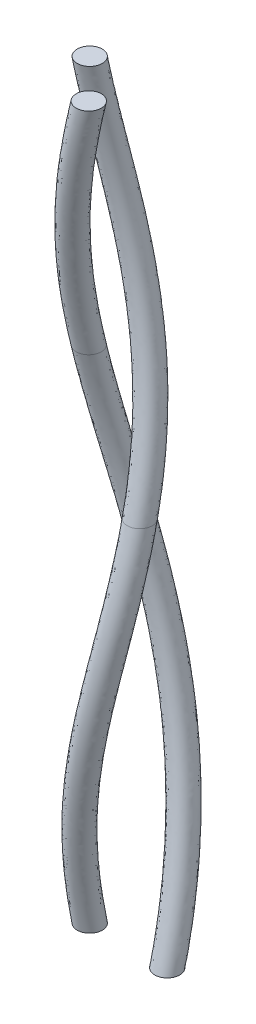
ISO-10303-21;
HEADER;
FILE_DESCRIPTION(('STEP AP214'),'2;1');
FILE_NAME('part.step','',(''),(''),'','','');
FILE_SCHEMA(('AUTOMOTIVE_DESIGN { 1 0 10303 214 1 1 1 1 }'));
ENDSEC;
DATA;
#1=APPLICATION_CONTEXT('core data for automotive mechanical design processes');
#2=APPLICATION_PROTOCOL_DEFINITION('international standard','automotive_design',2000,#1);
#3=PRODUCT_CONTEXT('',#1,'mechanical');
#4=PRODUCT('Part','Part','',(#3));
#5=PRODUCT_RELATED_PRODUCT_CATEGORY('part','',(#4));
#6=PRODUCT_DEFINITION_FORMATION('','',#4);
#7=PRODUCT_DEFINITION_CONTEXT('part definition',#1,'design');
#8=PRODUCT_DEFINITION('design','',#6,#7);
#9=PRODUCT_DEFINITION_SHAPE('','',#8);
#10=(LENGTH_UNIT() NAMED_UNIT(*) SI_UNIT(.MILLI.,.METRE.));
#11=(NAMED_UNIT(*) PLANE_ANGLE_UNIT() SI_UNIT($,.RADIAN.));
#12=(NAMED_UNIT(*) SI_UNIT($,.STERADIAN.) SOLID_ANGLE_UNIT());
#13=UNCERTAINTY_MEASURE_WITH_UNIT(LENGTH_MEASURE(1.E-05),#10,'distance_accuracy_value','');
#14=(GEOMETRIC_REPRESENTATION_CONTEXT(3) GLOBAL_UNCERTAINTY_ASSIGNED_CONTEXT((#13)) GLOBAL_UNIT_ASSIGNED_CONTEXT((#10,
#11,#12)) REPRESENTATION_CONTEXT('',''));
#15=CARTESIAN_POINT('',(0.,0.,0.));
#16=DIRECTION('',(0.,0.,1.));
#17=DIRECTION('',(1.,0.,0.));
#18=AXIS2_PLACEMENT_3D('',#15,#16,#17);
#19=CARTESIAN_POINT('',(0.,0.,0.));
#20=DIRECTION('',(0.,1.,0.));
#21=DIRECTION('',(0.,0.,1.));
#22=AXIS2_PLACEMENT_3D('',#19,#20,#21);
#23=PLANE('',#22);
#24=CARTESIAN_POINT('',(-1.02935078025205,0.,0.));
#25=CARTESIAN_POINT('',(-1.02934778491233,0.,0.0281075656694176));
#26=CARTESIAN_POINT('',(-1.03172392125893,0.,0.0561967953211833));
#27=CARTESIAN_POINT('',(-1.04115976984137,0.,0.111621935563756));
#28=CARTESIAN_POINT('',(-1.04822511897658,0.,0.13895689820842));
#29=CARTESIAN_POINT('',(-1.06684191221286,0.,0.192032338497883));
#30=CARTESIAN_POINT('',(-1.07839058986254,0.,0.21777378808967));
#31=CARTESIAN_POINT('',(-1.10564589954854,0.,0.2669539843828));
#32=CARTESIAN_POINT('',(-1.12135265355608,0.,0.290392663508009));
#33=CARTESIAN_POINT('',(-1.15647770707939,0.,0.334299396001291));
#34=CARTESIAN_POINT('',(-1.17589587927898,0.,0.354767551227601));
#35=CARTESIAN_POINT('',(-1.2178937205352,0.,0.39215418800142));
#36=CARTESIAN_POINT('',(-1.24047351368511,0.,0.409072530153988));
#37=CARTESIAN_POINT('',(-1.28813652173462,0.,0.438867901355163));
#38=CARTESIAN_POINT('',(-1.31321800809676,0.,0.451747695677338));
#39=CARTESIAN_POINT('',(-1.36522122099889,0.,0.473130977814567));
#40=CARTESIAN_POINT('',(-1.39214535795949,0.,0.481628604283394));
#41=CARTESIAN_POINT('',(-1.44701952120674,0.,0.493975642278158));
#42=CARTESIAN_POINT('',(-1.47496882823875,0.,0.497828250800084));
#43=CARTESIAN_POINT('',(-1.53111884926834,0.,0.500786679649745));
#44=CARTESIAN_POINT('',(-1.55931957452949,0.,0.499892286233489));
#45=CARTESIAN_POINT('',(-1.61516916871067,0.,0.493381758688196));
#46=CARTESIAN_POINT('',(-1.64281806497723,0.,0.487765859136626));
#47=CARTESIAN_POINT('',(-1.69678214168477,0.,0.471971579221971));
#48=CARTESIAN_POINT('',(-1.7230972495742,0.,0.461792950964673));
#49=CARTESIAN_POINT('',(-1.77362742512537,0.,0.437170758976721));
#50=CARTESIAN_POINT('',(-1.79784393615686,0.,0.422730157144034));
#51=CARTESIAN_POINT('',(-1.84354152491675,0.,0.389968725204407));
#52=CARTESIAN_POINT('',(-1.86501891259351,0.,0.371642747467175));
#53=CARTESIAN_POINT('',(-1.90456256322821,0.,0.331670658783917));
#54=CARTESIAN_POINT('',(-1.92263344629098,0.,0.310029117922739));
#55=CARTESIAN_POINT('',(-1.95491104416531,0.,0.263988527759386));
#56=CARTESIAN_POINT('',(-1.96911230278507,0.,0.239585652828287));
#57=CARTESIAN_POINT('',(-1.99319466726297,0.,0.188780155368334));
#58=CARTESIAN_POINT('',(-2.00308236452988,0.,0.162380656766238));
#59=CARTESIAN_POINT('',(-2.01830195804453,0.,0.108251753989095));
#60=CARTESIAN_POINT('',(-2.02362622468371,0.,0.0805202041628728));
#61=CARTESIAN_POINT('',(-2.02953942841934,0.,0.0245567605973392));
#62=CARTESIAN_POINT('',(-2.03012836551579,0.,-0.0036751331419727));
#63=CARTESIAN_POINT('',(-2.0265572846441,0.,-0.0597894942630455));
#64=CARTESIAN_POINT('',(-2.02240517622573,0.,-0.0876724653989984));
#65=CARTESIAN_POINT('',(-2.009472474825,0.,-0.14238904502068));
#66=CARTESIAN_POINT('',(-2.00068478311646,0.,-0.169220976105307));
#67=CARTESIAN_POINT('',(-1.97874199769132,0.,-0.220990594946259));
#68=CARTESIAN_POINT('',(-1.9655930392013,0.,-0.245930883560229));
#69=CARTESIAN_POINT('',(-1.93527639305996,0.,-0.293284543883329));
#70=CARTESIAN_POINT('',(-1.91810323222205,0.,-0.315694411983951));
#71=CARTESIAN_POINT('',(-1.88026158226737,0.,-0.357282758548085));
#72=CARTESIAN_POINT('',(-1.8595977775233,0.,-0.376465499784306));
#73=CARTESIAN_POINT('',(-1.81532923146071,0.,-0.411104304744368));
#74=CARTESIAN_POINT('',(-1.79172245963676,0.,-0.426557773626497));
#75=CARTESIAN_POINT('',(-1.74225089089742,0.,-0.45328126028907));
#76=CARTESIAN_POINT('',(-1.716386216739,0.,-0.464551505327056));
#77=CARTESIAN_POINT('',(-1.66313055076695,0.,-0.482590301878281));
#78=CARTESIAN_POINT('',(-1.6357394831862,0.,-0.489358629709243));
#79=CARTESIAN_POINT('',(-1.58021110221265,0.,-0.498200352920289));
#80=CARTESIAN_POINT('',(-1.55207382247547,0.,-0.500273959678384));
#81=CARTESIAN_POINT('',(-1.49583099489753,0.,-0.499667753972408));
#82=CARTESIAN_POINT('',(-1.46772548228668,0.,-0.496984664792098));
#83=CARTESIAN_POINT('',(-1.41240171824657,0.,-0.486941754879314));
#84=CARTESIAN_POINT('',(-1.38518233459034,0.,-0.479588169815938));
#85=CARTESIAN_POINT('',(-1.3323448865272,0.,-0.460411867683127));
#86=CARTESIAN_POINT('',(-1.3067279345716,0.,-0.448586085155848));
#87=CARTESIAN_POINT('',(-1.25784405051188,0.,-0.420802184086019));
#88=CARTESIAN_POINT('',(-1.23457702618697,0.,-0.404844227794565));
#89=CARTESIAN_POINT('',(-1.19105152434066,0.,-0.369247862358682));
#90=CARTESIAN_POINT('',(-1.17079315003659,0.,-0.349609326997414));
#91=CARTESIAN_POINT('',(-1.13386150566105,0.,-0.307211246177597));
#92=CARTESIAN_POINT('',(-1.11718813043453,0.,-0.284451792293772));
#93=CARTESIAN_POINT('',(-1.08789017474263,0.,-0.236439115378521));
#94=CARTESIAN_POINT('',(-1.07526809651121,0.,-0.211184363700803));
#95=CARTESIAN_POINT('',(-1.05445728370464,0.,-0.158955143146708));
#96=CARTESIAN_POINT('',(-1.0462632348178,0.,-0.131982779342234));
#97=CARTESIAN_POINT('',(-1.03306417630564,0.,-0.070188947042272));
#98=CARTESIAN_POINT('',(-1.02935451864391,0.,-0.0350801927224873));
#99=CARTESIAN_POINT('',(-1.02935078025205,0.,0.));
#100=B_SPLINE_CURVE_WITH_KNOTS('',3,(#24,#25,#26,#27,#28,#29,#30,#31,#32,#33,#34,#35,#36,#37,
#38,#39,#40,#41,#42,#43,#44,#45,#46,#47,#48,#49,#50,#51,#52,#53,#54,#55,#56,#57,#58,#59,#60,#61,
#62,#63,#64,#65,#66,#67,#68,#69,#70,#71,#72,#73,#74,#75,#76,#77,#78,#79,#80,#81,#82,#83,#84,#85,
#86,#87,#88,#89,#90,#91,#92,#93,#94,#95,#96,#97,#98,#99),.UNSPECIFIED.,.T.,.F.,(4,2,2,2,2,2,2,2,
2,2,2,2,2,2,2,2,2,2,2,2,2,2,2,2,2,2,2,2,2,2,2,2,2,2,2,2,2,4),(0.,0.0841916038121417,
0.168484598045371,0.252725661494656,0.336969196308829,0.421209841758488,0.505453794571877,
0.589639937279774,0.67393839256728,0.758178795129522,0.842422990829589,0.926663001292596,
1.01090758909161,1.09509376764329,1.17939218708701,1.26357544019679,1.34787678505409,
1.43204885674619,1.5163613828988,1.60067390905153,1.68484598074376,1.76914732560136,
1.85333057871152,1.93762899815566,2.02181517670778,2.10605976450711,2.19029977497041,
2.27454397067062,2.3587843732329,2.44308282852008,2.52726897122762,2.6115129240407,
2.69575356949004,2.77999710430378,2.86423816775269,2.94853116198561,3.03272276579744,
3.13779973055785),.UNSPECIFIED.);
#101=CARTESIAN_POINT('',(-1.02935078025205,0.,0.));
#102=VERTEX_POINT('',#101);
#103=EDGE_CURVE('P0_E20',#102,#102,#100,.T.);
#104=ORIENTED_EDGE('',*,*,#103,.T.);
#105=EDGE_LOOP('',(#104));
#106=FACE_BOUND('',#105,.T.);
#107=ADVANCED_FACE('P0_F16',(#106),#23,.F.);
#108=CARTESIAN_POINT('',(-2.02935078025,0.,0.));
#109=CARTESIAN_POINT('',(-2.02935078025,0.,2.));
#110=CARTESIAN_POINT('',(-0.0293507802541,0.,1.));
#111=CARTESIAN_POINT('',(-0.0293507802541,0.,-1.));
#112=CARTESIAN_POINT('',(-2.02935078025,0.,-2.));
#113=CARTESIAN_POINT('',(-2.02935078025,0.,0.));
#114=CARTESIAN_POINT('',(-2.02935078022,1.68646457974,0.337952972793));
#115=CARTESIAN_POINT('',(-2.02935078022,1.68646457974,2.33795297284));
#116=CARTESIAN_POINT('',(-0.0293507802355,1.54490316746,1.33795297281));
#117=CARTESIAN_POINT('',(-0.0293507802355,1.54490316746,-0.662047027229));
#118=CARTESIAN_POINT('',(-2.02935078022,1.68646457974,-1.66204702719));
#119=CARTESIAN_POINT('',(-2.02935078022,1.68646457974,0.337952972793));
#120=CARTESIAN_POINT('',(-1.88013932247,3.37292915642,0.675905945559));
#121=CARTESIAN_POINT('',(-1.88013932247,3.37292915642,2.67590592559));
#122=CARTESIAN_POINT('',(0.107335925808,3.08980633789,1.67590593993));
#123=CARTESIAN_POINT('',(0.107335925808,3.08980633791,-0.324094051256));
#124=CARTESIAN_POINT('',(-1.88013928179,3.37292915641,-1.32409406007));
#125=CARTESIAN_POINT('',(-1.88013932247,3.37292915642,0.675905945559));
#126=CARTESIAN_POINT('',(-1.58113487652,5.03733098523,0.934566611814001));
#127=CARTESIAN_POINT('',(-1.58113487652,5.03733098523,2.93456661015));
#128=CARTESIAN_POINT('',(0.381555449184,4.65319651354,1.93456661215));
#129=CARTESIAN_POINT('',(0.381555449184,4.65319651354,-0.0654333881865));
#130=CARTESIAN_POINT('',(-1.58113487652,5.03733098523,-1.06543338785));
#131=CARTESIAN_POINT('',(-1.58113487652,5.03733098523,0.934566611814001));
#132=CARTESIAN_POINT('',(-0.912997707135001,8.0854853718,1.12109178218));
#133=CARTESIAN_POINT('',(-0.912997707135001,8.0854853718,3.12109178357));
#134=CARTESIAN_POINT('',(1.03479747651,7.62778621052,2.12109178191));
#135=CARTESIAN_POINT('',(1.03479747651,7.62778621052,0.121091782185));
#136=CARTESIAN_POINT('',(-0.912997707135001,8.0854853718,-0.878908218093));
#137=CARTESIAN_POINT('',(-0.912997707135001,8.0854853718,1.12109178218));
#138=CARTESIAN_POINT('',(-0.330100700506,11.0337392183,0.814995660077001));
#139=CARTESIAN_POINT('',(-0.330100700506,11.0337392183,2.81499565892));
#140=CARTESIAN_POINT('',(1.64240748828,10.6965793179,1.81499566031));
#141=CARTESIAN_POINT('',(1.64240748828,10.6965793179,-0.185004339923));
#142=CARTESIAN_POINT('',(-0.330100700506,11.0337392183,-1.18500433969));
#143=CARTESIAN_POINT('',(-0.330100700506,11.0337392183,0.814995660077001));
#144=CARTESIAN_POINT('',(-0.129766807212,12.3552487741,0.580108745187));
#145=CARTESIAN_POINT('',(-0.129766807212,12.3552487741,2.58010874117));
#146=CARTESIAN_POINT('',(1.8610071338,12.1122534278,1.58010874104));
#147=CARTESIAN_POINT('',(1.8610071338,12.1122534278,-0.419891252473));
#148=CARTESIAN_POINT('',(-0.129766807212,12.3552487741,-1.41989125896));
#149=CARTESIAN_POINT('',(-0.129766807212,12.3552487741,0.580108745187));
#150=CARTESIAN_POINT('',(-0.0293507802505,13.6776243926,0.290054376966));
#151=CARTESIAN_POINT('',(-0.0293507802505,13.6776243926,2.29005437704));
#152=CARTESIAN_POINT('',(1.97064921975,13.5561266974,1.29005437698));
#153=CARTESIAN_POINT('',(1.97064921975,13.5561266974,-0.709945623053));
#154=CARTESIAN_POINT('',(-0.0293507802505,13.6776243926,-1.70994562302));
#155=CARTESIAN_POINT('',(-0.0293507802505,13.6776243926,0.290054376966));
#156=CARTESIAN_POINT('',(-0.0293507802541,15.,0.));
#157=CARTESIAN_POINT('',(-0.0293507802541,15.,2.));
#158=CARTESIAN_POINT('',(1.97064921975,15.,1.));
#159=CARTESIAN_POINT('',(1.97064921975,15.,-1.));
#160=CARTESIAN_POINT('',(-0.0293507802541,15.,-2.));
#161=CARTESIAN_POINT('',(-0.0293507802541,15.,0.));
#162=(BOUNDED_SURFACE() B_SPLINE_SURFACE(5,5,((#108,#109,#110,#111,#112,#113),(#114,#115,#116,
#117,#118,#119),(#120,#121,#122,#123,#124,#125),(#126,#127,#128,#129,#130,#131),(#132,#133,#134,
#135,#136,#137),(#138,#139,#140,#141,#142,#143),(#144,#145,#146,#147,#148,#149),(#150,#151,#152,
#153,#154,#155),(#156,#157,#158,#159,#160,#161)),.UNSPECIFIED.,.F.,.T.,
.F.) B_SPLINE_SURFACE_WITH_KNOTS((6,3,6),(6,6),(0.,8.37540446275,15.3482800251),(0.,
3.14159265359),.UNSPECIFIED.) GEOMETRIC_REPRESENTATION_ITEM() RATIONAL_B_SPLINE_SURFACE(((1.,
0.2,0.2,0.2,0.2,1.),(1.,0.2,0.2,0.2,0.2,1.),(1.,0.2,0.2,0.2,0.2,1.),(1.,0.2,0.2,0.2,0.2,1.),(1.,
0.2,0.2,0.2,0.2,1.),(1.,0.2,0.2,0.2,0.2,1.),(1.,0.2,0.2,0.2,0.2,1.),(1.,0.2,0.2,0.2,0.2,1.),(1.,
0.2,0.2,0.2,0.2,1.))) REPRESENTATION_ITEM('') SURFACE());
#163=CARTESIAN_POINT('',(0.470649219746925,15.,-9.84065259835469E-13));
#164=DIRECTION('',(0.,-1.,0.));
#165=DIRECTION('',(0.,0.,-1.));
#166=AXIS2_PLACEMENT_3D('',#163,#164,#165);
#167=CIRCLE('',#166,0.500000000001025);
#168=CARTESIAN_POINT('',(-0.0293507802541,15.,0.));
#169=VERTEX_POINT('',#168);
#170=CARTESIAN_POINT('',(0.97064921974795,15.,0.));
#171=VERTEX_POINT('',#170);
#172=EDGE_CURVE('P0_E29',#169,#171,#167,.T.);
#173=CARTESIAN_POINT('',(0.470649219746925,15.,-9.84065259835469E-13));
#174=DIRECTION('',(0.,-1.,0.));
#175=DIRECTION('',(0.,0.,-1.));
#176=AXIS2_PLACEMENT_3D('',#173,#174,#175);
#177=CIRCLE('',#176,0.500000000001025);
#178=EDGE_CURVE('P0_E44',#171,#169,#177,.T.);
#179=ORIENTED_EDGE('',*,*,#103,.F.);
#180=EDGE_LOOP('',(#179));
#181=FACE_BOUND('',#180,.T.);
#182=ORIENTED_EDGE('',*,*,#172,.T.);
#183=ORIENTED_EDGE('',*,*,#178,.T.);
#184=EDGE_LOOP('',(#182,#183));
#185=FACE_BOUND('',#184,.T.);
#186=ADVANCED_FACE('P0_F50',(#181,#185),#162,.F.);
#187=CARTESIAN_POINT('',(0.,30.,0.));
#188=DIRECTION('',(0.,1.,0.));
#189=DIRECTION('',(-1.,0.,0.));
#190=AXIS2_PLACEMENT_3D('',#187,#188,#189);
#191=PLANE('',#190);
#192=CARTESIAN_POINT('',(-2.02935078025,30.,5.68403351437524E-11));
#193=CARTESIAN_POINT('',(-2.02935377558655,30.,0.028107565726252));
#194=CARTESIAN_POINT('',(-2.02697763923679,30.,0.0561967953777653));
#195=CARTESIAN_POINT('',(-2.01754179064799,30.,0.11162193561924));
#196=CARTESIAN_POINT('',(-2.01047644150958,30.,0.138956898263058));
#197=CARTESIAN_POINT('',(-1.99185964826745,30.,0.192032338550511));
#198=CARTESIAN_POINT('',(-1.98031097061513,30.,0.217773788141135));
#199=CARTESIAN_POINT('',(-1.95305566092353,30.,0.266953984431146));
#200=CARTESIAN_POINT('',(-1.93734890691304,30.,0.2903926635544));
#201=CARTESIAN_POINT('',(-1.90222385338459,30.,0.33429939604365));
#202=CARTESIAN_POINT('',(-1.88280568118281,30.,0.354767551267884));
#203=CARTESIAN_POINT('',(-1.84080783992238,30.,0.392154188036907));
#204=CARTESIAN_POINT('',(-1.81822804677043,30.,0.409072530186755));
#205=CARTESIAN_POINT('',(-1.77056503871754,30.,0.438867901382655));
#206=CARTESIAN_POINT('',(-1.74548355235408,30.,0.451747695702273));
#207=CARTESIAN_POINT('',(-1.69348033944952,30.,0.473130977833582));
#208=CARTESIAN_POINT('',(-1.66655620248785,30.,0.481628604299047));
#209=CARTESIAN_POINT('',(-1.61168203923911,30.,0.49397564228746));
#210=CARTESIAN_POINT('',(-1.58373273220668,30.,0.497828250806394));
#211=CARTESIAN_POINT('',(-1.52758271117677,30.,0.50078667964974));
#212=CARTESIAN_POINT('',(-1.49938198591572,30.,0.499892286230166));
#213=CARTESIAN_POINT('',(-1.44353239173532,30.,0.493381758678355));
#214=CARTESIAN_POINT('',(-1.41588349546945,30.,0.487765859123587));
#215=CARTESIAN_POINT('',(-1.3619194187637,30.,0.471971579202894));
#216=CARTESIAN_POINT('',(-1.33560431087536,30.,0.461792950942757));
#217=CARTESIAN_POINT('',(-1.28507413532713,30.,0.437170758948918));
#218=CARTESIAN_POINT('',(-1.26085762429748,30.,0.422730157113179));
#219=CARTESIAN_POINT('',(-1.21516003554125,30.,0.389968725168356));
#220=CARTESIAN_POINT('',(-1.19368264786631,30.,0.37164274742898));
#221=CARTESIAN_POINT('',(-1.15413899723615,30.,0.331670658741328));
#222=CARTESIAN_POINT('',(-1.13606811417609,30.,0.310029117877905));
#223=CARTESIAN_POINT('',(-1.10379051630703,30.,0.263988527710836));
#224=CARTESIAN_POINT('',(-1.08958925768982,30.,0.239585652778262));
#225=CARTESIAN_POINT('',(-1.06550689321761,30.,0.188780155315774));
#226=CARTESIAN_POINT('',(-1.05561919595382,30.,0.162380656712625));
#227=CARTESIAN_POINT('',(-1.04039960244538,30.,0.108251753933937));
#228=CARTESIAN_POINT('',(-1.0350753358093,30.,0.0805202041072227));
#229=CARTESIAN_POINT('',(-1.02916213207992,30.,0.0245567605410128));
#230=CARTESIAN_POINT('',(-1.02857319498667,30.,-0.00367513319848673));
#231=CARTESIAN_POINT('',(-1.03214427586471,30.,-0.0597894943193811));
#232=CARTESIAN_POINT('',(-1.03629638428623,30.,-0.0876724654549692));
#233=CARTESIAN_POINT('',(-1.04922908569327,30.,-0.142389045075248));
#234=CARTESIAN_POINT('',(-1.05801677740497,30.,-0.169220976158838));
#235=CARTESIAN_POINT('',(-1.07995956283596,30.,-0.220990594997325));
#236=CARTESIAN_POINT('',(-1.09310852132867,30.,-0.245930883609868));
#237=CARTESIAN_POINT('',(-1.12342516747545,30.,-0.293284543929417));
#238=CARTESIAN_POINT('',(-1.14059832831612,30.,-0.315694412027914));
#239=CARTESIAN_POINT('',(-1.17843997827555,30.,-0.357282758587766));
#240=CARTESIAN_POINT('',(-1.1991037830216,30.,-0.376465499821831));
#241=CARTESIAN_POINT('',(-1.24337232908803,30.,-0.411104304776895));
#242=CARTESIAN_POINT('',(-1.26697910091383,30.,-0.426557773656183));
#243=CARTESIAN_POINT('',(-1.31645066965623,30.,-0.453281260313163));
#244=CARTESIAN_POINT('',(-1.34231534381585,30.,-0.464551505348399));
#245=CARTESIAN_POINT('',(-1.39557100978994,30.,-0.482590301893401));
#246=CARTESIAN_POINT('',(-1.42296207737152,30.,-0.489358629720895));
#247=CARTESIAN_POINT('',(-1.47849045834609,30.,-0.498200352925581));
#248=CARTESIAN_POINT('',(-1.50662773808345,30.,-0.500273959680779));
#249=CARTESIAN_POINT('',(-1.56287056566135,30.,-0.499667753968789));
#250=CARTESIAN_POINT('',(-1.59097607827196,30.,-0.496984664785357));
#251=CARTESIAN_POINT('',(-1.64629984231098,30.,-0.486941754866171));
#252=CARTESIAN_POINT('',(-1.67351922596634,30.,-0.479588169799515));
#253=CARTESIAN_POINT('',(-1.72635667402735,30.,-0.460411867660669));
#254=CARTESIAN_POINT('',(-1.75197362598167,30.,-0.448586085130646));
#255=CARTESIAN_POINT('',(-1.80085751003809,30.,-0.420802184055224));
#256=CARTESIAN_POINT('',(-1.82412453436099,30.,-0.404844227760923));
#257=CARTESIAN_POINT('',(-1.86765003620353,30.,-0.369247862320328));
#258=CARTESIAN_POINT('',(-1.88790841050584,30.,-0.349609326957191));
#259=CARTESIAN_POINT('',(-1.92484005487654,30.,-0.307211246133195));
#260=CARTESIAN_POINT('',(-1.94151343009998,30.,-0.284451792247061));
#261=CARTESIAN_POINT('',(-1.97081138578619,30.,-0.236439115328179));
#262=CARTESIAN_POINT('',(-1.983433464015,30.,-0.211184363649136));
#263=CARTESIAN_POINT('',(-2.00424427681574,30.,-0.158955143092669));
#264=CARTESIAN_POINT('',(-2.01243832569938,30.,-0.131982779287148));
#265=CARTESIAN_POINT('',(-2.02563738420432,30.,-0.0701889469856565));
#266=CARTESIAN_POINT('',(-2.02934704186209,30.,-0.035080192665566));
#267=CARTESIAN_POINT('',(-2.02935078025,30.,5.68403351437524E-11));
#268=B_SPLINE_CURVE_WITH_KNOTS('',3,(#192,#193,#194,#195,#196,#197,#198,#199,#200,#201,#202,
#203,#204,#205,#206,#207,#208,#209,#210,#211,#212,#213,#214,#215,#216,#217,#218,#219,#220,#221,
#222,#223,#224,#225,#226,#227,#228,#229,#230,#231,#232,#233,#234,#235,#236,#237,#238,#239,#240,
#241,#242,#243,#244,#245,#246,#247,#248,#249,#250,#251,#252,#253,#254,#255,#256,#257,#258,#259,
#260,#261,#262,#263,#264,#265,#266,#267),.UNSPECIFIED.,.T.,.F.,(4,2,2,2,2,2,2,2,2,2,2,2,2,2,2,2,
2,2,2,2,2,2,2,2,2,2,2,2,2,2,2,2,2,2,2,2,2,4),(0.,0.0841916038121428,0.168484598045373,
0.252725661494685,0.336969196308902,0.421209841758572,0.505453794571973,0.589639937279916,
0.673938392567442,0.758178795129743,0.842422990829777,0.92666300129273,1.01090758909169,
1.09509376764336,1.1793921870871,1.26357544019681,1.34787678505412,1.43204885674586,
1.51636138289819,1.60067390905127,1.68484598074379,1.76914732560142,1.85333057871152,
1.93762899815565,2.02181517670774,2.10605976450705,2.19029977497034,2.27454397067048,
2.35878437323275,2.44308282852003,2.52726897122769,2.6115129240407,2.69575356948997,
2.77999710430377,2.86423816775275,2.94853116198581,3.03272276579778,3.13779973055793),.UNSPECIFIED.);
#269=CARTESIAN_POINT('',(-2.02935078025,30.,5.68403351421366E-11));
#270=VERTEX_POINT('',#269);
#271=EDGE_CURVE('P0_E11',#270,#270,#268,.T.);
#272=ORIENTED_EDGE('',*,*,#271,.T.);
#273=EDGE_LOOP('',(#272));
#274=FACE_BOUND('',#273,.T.);
#275=ADVANCED_FACE('P0_F63',(#274),#191,.T.);
#276=CARTESIAN_POINT('',(-0.0293507802541,15.,0.));
#277=CARTESIAN_POINT('',(-0.0293507802541,15.,2.));
#278=CARTESIAN_POINT('',(1.97064921975,15.,1.));
#279=CARTESIAN_POINT('',(1.97064921975,15.,-1.));
#280=CARTESIAN_POINT('',(-0.0293507802541,15.,-2.));
#281=CARTESIAN_POINT('',(-0.0293507802541,15.,0.));
#282=CARTESIAN_POINT('',(-0.0293507803229,16.566536433,-0.343609445206));
#283=CARTESIAN_POINT('',(-0.0293507803229,16.566536433,1.65639055478));
#284=CARTESIAN_POINT('',(1.97064921975,16.7104672227,0.656390554816));
#285=CARTESIAN_POINT('',(1.97064921975,16.7104672227,-1.34360944522));
#286=CARTESIAN_POINT('',(-0.0293507803229,16.566536433,-2.34360944529));
#287=CARTESIAN_POINT('',(-0.0293507803229,16.566536433,-0.343609445206));
#288=CARTESIAN_POINT('',(-0.170271302693,18.1330725557,-0.687218821193));
#289=CARTESIAN_POINT('',(-0.170271302693,18.1330725557,1.31278118463));
#290=CARTESIAN_POINT('',(1.8167811606,18.4209339051,0.312781175517));
#291=CARTESIAN_POINT('',(1.8167811606,18.4209339051,-1.68721881537));
#292=CARTESIAN_POINT('',(-0.170271302693,18.1330725557,-2.68721881552));
#293=CARTESIAN_POINT('',(-0.170271302693,18.1330725557,-0.687218821193));
#294=CARTESIAN_POINT('',(-0.451678273255,19.6989405483,-0.938098754839001));
#295=CARTESIAN_POINT('',(-0.451678273255,19.6989405483,1.06190124484));
#296=CARTESIAN_POINT('',(1.51073001464,20.084468106,0.0619012450008));
#297=CARTESIAN_POINT('',(1.51073001464,20.084468106,-1.93809875516));
#298=CARTESIAN_POINT('',(-0.451678273255,19.6989405483,-2.93809875452));
#299=CARTESIAN_POINT('',(-0.451678273255,19.6989405483,-0.938098754839001));
#300=CARTESIAN_POINT('',(-1.10176440105,22.6618814911,-1.11926103216));
#301=CARTESIAN_POINT('',(-1.10176440105,22.6618814911,0.880738968119001));
#302=CARTESIAN_POINT('',(0.846179578141001,23.1188603783,-0.119261032019));
#303=CARTESIAN_POINT('',(0.846179578141001,23.1188603783,-2.11926103188));
#304=CARTESIAN_POINT('',(-1.10176440105,22.6618814911,-3.11926103243));
#305=CARTESIAN_POINT('',(-1.10176440105,22.6618814911,-1.11926103216));
#306=CARTESIAN_POINT('',(-1.70769299572,25.7240220756,-0.811257791281001));
#307=CARTESIAN_POINT('',(-1.70769299572,25.7240220756,1.18874220848));
#308=CARTESIAN_POINT('',(0.265116967931,26.0597100218,0.188742208601));
#309=CARTESIAN_POINT('',(0.265116967931,26.0597100218,-1.81125779152));
#310=CARTESIAN_POINT('',(-1.70769299572,25.7240220756,-2.81125779104));
#311=CARTESIAN_POINT('',(-1.70769299572,25.7240220756,-0.811257791281001));
#312=CARTESIAN_POINT('',(-1.9223128854,27.1432320342,-0.572471692432));
#313=CARTESIAN_POINT('',(-1.9223128854,27.1432320342,1.42752829794));
#314=CARTESIAN_POINT('',(0.0687023974612,27.383028296,0.427528304832));
#315=CARTESIAN_POINT('',(0.0687023974612,27.383028296,-1.57247170206));
#316=CARTESIAN_POINT('',(-1.92231285622,27.1432320342,-2.57247168643));
#317=CARTESIAN_POINT('',(-1.9223128854,27.1432320342,-0.572471692432));
#318=CARTESIAN_POINT('',(-2.02935078022,28.5716161964,-0.286235808547));
#319=CARTESIAN_POINT('',(-2.02935078022,28.5716161964,1.71376419144));
#320=CARTESIAN_POINT('',(-0.0293507802383,28.6915143732,0.713764191472));
#321=CARTESIAN_POINT('',(-0.0293507802383,28.6915143732,-1.28623580856));
#322=CARTESIAN_POINT('',(-2.02935078022,28.5716161964,-2.2862358085));
#323=CARTESIAN_POINT('',(-2.02935078022,28.5716161964,-0.286235808547));
#324=CARTESIAN_POINT('',(-2.02935078025,30.,0.));
#325=CARTESIAN_POINT('',(-2.02935078025,30.,2.));
#326=CARTESIAN_POINT('',(-0.0293507802541,30.,1.));
#327=CARTESIAN_POINT('',(-0.0293507802541,30.,-1.));
#328=CARTESIAN_POINT('',(-2.02935078025,30.,-2.));
#329=CARTESIAN_POINT('',(-2.02935078025,30.,0.));
#330=(BOUNDED_SURFACE() B_SPLINE_SURFACE(5,5,((#276,#277,#278,#279,#280,#281),(#282,#283,#284,
#285,#286,#287),(#288,#289,#290,#291,#292,#293),(#294,#295,#296,#297,#298,#299),(#300,#301,#302,
#303,#304,#305),(#306,#307,#308,#309,#310,#311),(#312,#313,#314,#315,#316,#317),(#318,#319,#320,
#321,#322,#323),(#324,#325,#326,#327,#328,#329)),.UNSPECIFIED.,.F.,.T.,
.F.) B_SPLINE_SURFACE_WITH_KNOTS((6,3,6),(6,6),(0.,8.26033356074,15.3540444082),(0.,
3.14159265359),.UNSPECIFIED.) GEOMETRIC_REPRESENTATION_ITEM() RATIONAL_B_SPLINE_SURFACE(((1.,
0.2,0.2,0.2,0.2,1.),(1.,0.2,0.2,0.2,0.2,1.),(1.,0.2,0.2,0.2,0.2,1.),(1.,0.2,0.2,0.2,0.2,1.),(1.,
0.2,0.2,0.2,0.2,1.),(1.,0.2,0.2,0.2,0.2,1.),(1.,0.2,0.2,0.2,0.2,1.),(1.,0.2,0.2,0.2,0.2,1.),(1.,
0.2,0.2,0.2,0.2,1.))) REPRESENTATION_ITEM('') SURFACE());
#331=ORIENTED_EDGE('',*,*,#271,.F.);
#332=EDGE_LOOP('',(#331));
#333=FACE_BOUND('',#332,.T.);
#334=ORIENTED_EDGE('',*,*,#178,.F.);
#335=ORIENTED_EDGE('',*,*,#172,.F.);
#336=EDGE_LOOP('',(#334,#335));
#337=FACE_BOUND('',#336,.T.);
#338=ADVANCED_FACE('P0_F46',(#333,#337),#330,.F.);
#339=CLOSED_SHELL('',(#107,#186,#275,#338));
#340=MANIFOLD_SOLID_BREP('P0_B1',#339);
#341=CARTESIAN_POINT('',(0.,30.,0.));
#342=DIRECTION('',(0.,1.,0.));
#343=DIRECTION('',(-1.,0.,0.));
#344=AXIS2_PLACEMENT_3D('',#341,#342,#343);
#345=PLANE('',#344);
#346=CARTESIAN_POINT('',(0.,30.,2.06797337912));
#347=CARTESIAN_POINT('',(0.0281075656693735,30.,2.06797637445984));
#348=CARTESIAN_POINT('',(0.0561967953211657,30.,2.0656002381134));
#349=CARTESIAN_POINT('',(0.111621935563545,30.,2.05616438953073));
#350=CARTESIAN_POINT('',(0.138956898207989,30.,2.04909904039512));
#351=CARTESIAN_POINT('',(0.192032338497809,30.,2.03048224715961));
#352=CARTESIAN_POINT('',(0.21777378809017,30.,2.0189335695111));
#353=CARTESIAN_POINT('',(0.266953984383161,30.,1.99167825982514));
#354=CARTESIAN_POINT('',(0.290392663507656,30.,1.97597150581646));
#355=CARTESIAN_POINT('',(0.334299396000632,30.,1.94084645229253));
#356=CARTESIAN_POINT('',(0.35476755122735,30.,1.92142828009344));
#357=CARTESIAN_POINT('',(0.392154188001194,30.,1.87943043883744));
#358=CARTESIAN_POINT('',(0.409072530153379,30.,1.85685064568724));
#359=CARTESIAN_POINT('',(0.438867901354815,30.,1.80918763763769));
#360=CARTESIAN_POINT('',(0.451747695677625,30.,1.78410615127582));
#361=CARTESIAN_POINT('',(0.473130977814961,30.,1.73210293837369));
#362=CARTESIAN_POINT('',(0.481628604283262,30.,1.70517880141285));
#363=CARTESIAN_POINT('',(0.49397564227786,30.,1.65030463816533));
#364=CARTESIAN_POINT('',(0.497828250800132,30.,1.62235533113327));
#365=CARTESIAN_POINT('',(0.500786679650007,30.,1.56620531010355));
#366=CARTESIAN_POINT('',(0.499892286233627,30.,1.53800458484232));
#367=CARTESIAN_POINT('',(0.493381758688245,30.,1.48215499066094));
#368=CARTESIAN_POINT('',(0.487765859136703,30.,1.45450609439427));
#369=CARTESIAN_POINT('',(0.471971579222122,30.,1.40054201768649));
#370=CARTESIAN_POINT('',(0.461792950964873,30.,1.37422690979691));
#371=CARTESIAN_POINT('',(0.437170758976934,30.,1.32369673424551));
#372=CARTESIAN_POINT('',(0.422730157144214,30.,1.29948022321392));
#373=CARTESIAN_POINT('',(0.389968725204516,30.,1.25378263445384));
#374=CARTESIAN_POINT('',(0.371642747467245,30.,1.23230524677699));
#375=CARTESIAN_POINT('',(0.331670658783992,30.,1.19276159614203));
#376=CARTESIAN_POINT('',(0.310029117922862,30.,1.17469071307909));
#377=CARTESIAN_POINT('',(0.263988527759439,30.,1.14241311520467));
#378=CARTESIAN_POINT('',(0.23958565282822,30.,1.12821185658498));
#379=CARTESIAN_POINT('',(0.188780155368168,30.,1.10412949210707));
#380=CARTESIAN_POINT('',(0.162380656766095,30.,1.09424179484009));
#381=CARTESIAN_POINT('',(0.108251753988967,30.,1.0790222013254));
#382=CARTESIAN_POINT('',(0.0805202041627368,30.,1.07369793468627));
#383=CARTESIAN_POINT('',(0.024556760597246,30.,1.06778473095067));
#384=CARTESIAN_POINT('',(-0.00367513314201442,30.,1.0671957938542));
#385=CARTESIAN_POINT('',(-0.0597894942629914,30.,1.0707668747259));
#386=CARTESIAN_POINT('',(-0.0876724653988998,30.,1.0749189831443));
#387=CARTESIAN_POINT('',(-0.142389045020518,30.,1.08785168454496));
#388=CARTESIAN_POINT('',(-0.169220976105126,30.,1.0966393762534));
#389=CARTESIAN_POINT('',(-0.220990594945969,30.,1.1185821616785));
#390=CARTESIAN_POINT('',(-0.245930883559849,30.,1.13173112016859));
#391=CARTESIAN_POINT('',(-0.293284543882858,30.,1.16204776630993));
#392=CARTESIAN_POINT('',(-0.315694411983476,30.,1.17922092714778));
#393=CARTESIAN_POINT('',(-0.357282758547612,30.,1.21706257710238));
#394=CARTESIAN_POINT('',(-0.376465499783838,30.,1.23772638184642));
#395=CARTESIAN_POINT('',(-0.411104304743799,30.,1.28199492790903));
#396=CARTESIAN_POINT('',(-0.426557773625817,30.,1.30560169973303));
#397=CARTESIAN_POINT('',(-0.453281260288652,30.,1.35507326847233));
#398=CARTESIAN_POINT('',(-0.464551505327013,30.,1.38093794263067));
#399=CARTESIAN_POINT('',(-0.482590301877675,30.,1.43419360860286));
#400=CARTESIAN_POINT('',(-0.489358629707697,30.,1.46158467618384));
#401=CARTESIAN_POINT('',(-0.498200352918864,30.,1.51711305715756));
#402=CARTESIAN_POINT('',(-0.500273959678018,30.,1.54525033689466));
#403=CARTESIAN_POINT('',(-0.499667753972793,30.,1.60149316447265));
#404=CARTESIAN_POINT('',(-0.496984664792162,30.,1.62959867708363));
#405=CARTESIAN_POINT('',(-0.486941754879216,30.,1.68492244112397));
#406=CARTESIAN_POINT('',(-0.479588169815996,30.,1.7121418247803));
#407=CARTESIAN_POINT('',(-0.46041186768347,30.,1.7649792728438));
#408=CARTESIAN_POINT('',(-0.448586085156318,30.,1.79059622479965));
#409=CARTESIAN_POINT('',(-0.420802184086248,30.,1.83948010885941));
#410=CARTESIAN_POINT('',(-0.404844227794428,30.,1.86274713318412));
#411=CARTESIAN_POINT('',(-0.369247862359062,30.,1.90627263503131));
#412=CARTESIAN_POINT('',(-0.349609326998678,30.,1.92653100933647));
#413=CARTESIAN_POINT('',(-0.3072112461788,30.,1.96346265371209));
#414=CARTESIAN_POINT('',(-0.284451792294026,30.,1.98013602893759));
#415=CARTESIAN_POINT('',(-0.236439115378173,30.,2.00943398462911));
#416=CARTESIAN_POINT('',(-0.21118436370081,30.,2.02205606286118));
#417=CARTESIAN_POINT('',(-0.158955143146856,30.,2.042866875668));
#418=CARTESIAN_POINT('',(-0.131982779342169,30.,2.05106092455445));
#419=CARTESIAN_POINT('',(-0.070188947042077,30.,2.06425998306616));
#420=CARTESIAN_POINT('',(-0.0350801927224424,30.,2.06796964072799));
#421=CARTESIAN_POINT('',(0.,30.,2.06797337912));
#422=B_SPLINE_CURVE_WITH_KNOTS('',3,(#346,#347,#348,#349,#350,#351,#352,#353,#354,#355,#356,
#357,#358,#359,#360,#361,#362,#363,#364,#365,#366,#367,#368,#369,#370,#371,#372,#373,#374,#375,
#376,#377,#378,#379,#380,#381,#382,#383,#384,#385,#386,#387,#388,#389,#390,#391,#392,#393,#394,
#395,#396,#397,#398,#399,#400,#401,#402,#403,#404,#405,#406,#407,#408,#409,#410,#411,#412,#413,
#414,#415,#416,#417,#418,#419,#420,#421),.UNSPECIFIED.,.T.,.F.,(4,2,2,2,2,2,2,2,2,2,2,2,2,2,2,2,
2,2,2,2,2,2,2,2,2,2,2,2,2,2,2,2,2,2,2,2,2,4),(0.,0.084191603812023,0.168484598045133,
0.252725661494408,0.336969196308612,0.421209841758248,0.505453794571614,0.589639937279719,
0.673938392567364,0.758178795129966,0.842422990830233,0.926663001293582,1.01090758909293,
1.0950937676449,1.17939218708893,1.2635754401989,1.34787678505639,1.43204885674853,
1.51636138290112,1.60067390905369,1.68484598074582,1.76914732560326,1.85333057871327,
1.93762899815732,2.02181517670935,2.10605976450871,2.19029977497206,2.27454397067238,
2.35878437323476,2.44308282852225,2.52726897123011,2.61151292404353,2.69575356949322,
2.77999710430731,2.86423816775661,2.94853116198964,3.03272276580157,3.1377997305618),.UNSPECIFIED.);
#423=CARTESIAN_POINT('',(0.,30.,2.06797337912));
#424=VERTEX_POINT('',#423);
#425=EDGE_CURVE('P1_E20',#424,#424,#422,.T.);
#426=ORIENTED_EDGE('',*,*,#425,.T.);
#427=EDGE_LOOP('',(#426));
#428=FACE_BOUND('',#427,.T.);
#429=ADVANCED_FACE('P1_F16',(#428),#345,.T.);
#430=CARTESIAN_POINT('',(0.,0.,0.));
#431=DIRECTION('',(0.,1.,0.));
#432=DIRECTION('',(0.,0.,1.));
#433=AXIS2_PLACEMENT_3D('',#430,#431,#432);
#434=PLANE('',#433);
#435=CARTESIAN_POINT('',(2.06797337912,0.,0.));
#436=CARTESIAN_POINT('',(2.06797637445984,0.,0.0281075656693828));
#437=CARTESIAN_POINT('',(2.0656002381134,0.,0.0561967953211747));
#438=CARTESIAN_POINT('',(2.05616438953072,0.,0.111621935563553));
#439=CARTESIAN_POINT('',(2.04909904039511,0.,0.138956898207998));
#440=CARTESIAN_POINT('',(2.0304822471596,0.,0.192032338497816));
#441=CARTESIAN_POINT('',(2.01893356951109,0.,0.217773788090177));
#442=CARTESIAN_POINT('',(1.99167825982513,0.,0.266953984383167));
#443=CARTESIAN_POINT('',(1.97597150581646,0.,0.290392663507661));
#444=CARTESIAN_POINT('',(1.94084645229253,0.,0.334299396000636));
#445=CARTESIAN_POINT('',(1.92142828009344,0.,0.354767551227355));
#446=CARTESIAN_POINT('',(1.87943043883744,0.,0.392154188001199));
#447=CARTESIAN_POINT('',(1.85685064568724,0.,0.409072530153382));
#448=CARTESIAN_POINT('',(1.80918763763769,0.,0.438867901354819));
#449=CARTESIAN_POINT('',(1.78410615127581,0.,0.451747695677629));
#450=CARTESIAN_POINT('',(1.73210293837368,0.,0.473130977814964));
#451=CARTESIAN_POINT('',(1.70517880141285,0.,0.481628604283264));
#452=CARTESIAN_POINT('',(1.65030463816532,0.,0.493975642277862));
#453=CARTESIAN_POINT('',(1.62235533113327,0.,0.497828250800134));
#454=CARTESIAN_POINT('',(1.56620531010355,0.,0.500786679650008));
#455=CARTESIAN_POINT('',(1.53800458484231,0.,0.499892286233627));
#456=CARTESIAN_POINT('',(1.48215499066093,0.,0.493381758688243));
#457=CARTESIAN_POINT('',(1.45450609439427,0.,0.487765859136701));
#458=CARTESIAN_POINT('',(1.40054201768649,0.,0.471971579222119));
#459=CARTESIAN_POINT('',(1.37422690979691,0.,0.46179295096487));
#460=CARTESIAN_POINT('',(1.3236967342455,0.,0.437170758976931));
#461=CARTESIAN_POINT('',(1.29948022321392,0.,0.42273015714421));
#462=CARTESIAN_POINT('',(1.25378263445383,0.,0.389968725204512));
#463=CARTESIAN_POINT('',(1.23230524677698,0.,0.371642747467241));
#464=CARTESIAN_POINT('',(1.19276159614202,0.,0.331670658783986));
#465=CARTESIAN_POINT('',(1.17469071307908,0.,0.310029117922856));
#466=CARTESIAN_POINT('',(1.14241311520466,0.,0.263988527759433));
#467=CARTESIAN_POINT('',(1.12821185658497,0.,0.239585652828215));
#468=CARTESIAN_POINT('',(1.10412949210707,0.,0.188780155368162));
#469=CARTESIAN_POINT('',(1.09424179484008,0.,0.16238065676609));
#470=CARTESIAN_POINT('',(1.0790222013254,0.,0.108251753988961));
#471=CARTESIAN_POINT('',(1.07369793468627,0.,0.0805202041627307));
#472=CARTESIAN_POINT('',(1.06778473095067,0.,0.0245567605972396));
#473=CARTESIAN_POINT('',(1.0671957938542,0.,-0.00367513314202111));
#474=CARTESIAN_POINT('',(1.0707668747259,0.,-0.0597894942629986));
#475=CARTESIAN_POINT('',(1.07491898314431,0.,-0.0876724653989072));
#476=CARTESIAN_POINT('',(1.08785168454496,0.,-0.142389045020525));
#477=CARTESIAN_POINT('',(1.0966393762534,0.,-0.169220976105133));
#478=CARTESIAN_POINT('',(1.1185821616785,0.,-0.220990594945976));
#479=CARTESIAN_POINT('',(1.13173112016859,0.,-0.245930883559856));
#480=CARTESIAN_POINT('',(1.16204776630993,0.,-0.293284543882864));
#481=CARTESIAN_POINT('',(1.17922092714779,0.,-0.315694411983482));
#482=CARTESIAN_POINT('',(1.21706257710239,0.,-0.357282758547616));
#483=CARTESIAN_POINT('',(1.23772638184643,0.,-0.376465499783841));
#484=CARTESIAN_POINT('',(1.28199492790904,0.,-0.411104304743801));
#485=CARTESIAN_POINT('',(1.30560169973303,0.,-0.426557773625819));
#486=CARTESIAN_POINT('',(1.35507326847234,0.,-0.453281260288655));
#487=CARTESIAN_POINT('',(1.38093794263067,0.,-0.464551505327015));
#488=CARTESIAN_POINT('',(1.43419360860287,0.,-0.482590301877677));
#489=CARTESIAN_POINT('',(1.46158467618385,0.,-0.489358629707697));
#490=CARTESIAN_POINT('',(1.51711305715756,0.,-0.498200352918863));
#491=CARTESIAN_POINT('',(1.54525033689466,0.,-0.500273959678018));
#492=CARTESIAN_POINT('',(1.60149316447266,0.,-0.499667753972793));
#493=CARTESIAN_POINT('',(1.62959867708364,0.,-0.496984664792162));
#494=CARTESIAN_POINT('',(1.68492244112398,0.,-0.486941754879214));
#495=CARTESIAN_POINT('',(1.71214182478031,0.,-0.479588169815994));
#496=CARTESIAN_POINT('',(1.76497927284381,0.,-0.460411867683467));
#497=CARTESIAN_POINT('',(1.79059622479965,0.,-0.448586085156315));
#498=CARTESIAN_POINT('',(1.83948010885941,0.,-0.420802184086245));
#499=CARTESIAN_POINT('',(1.86274713318412,0.,-0.404844227794424));
#500=CARTESIAN_POINT('',(1.90627263503131,0.,-0.369247862359057));
#501=CARTESIAN_POINT('',(1.92653100933647,0.,-0.349609326998673));
#502=CARTESIAN_POINT('',(1.96346265371209,0.,-0.307211246178794));
#503=CARTESIAN_POINT('',(1.98013602893759,0.,-0.28445179229402));
#504=CARTESIAN_POINT('',(2.00943398462911,0.,-0.236439115378166));
#505=CARTESIAN_POINT('',(2.02205606286118,0.,-0.211184363700803));
#506=CARTESIAN_POINT('',(2.04286687566801,0.,-0.158955143146849));
#507=CARTESIAN_POINT('',(2.05106092455445,0.,-0.131982779342161));
#508=CARTESIAN_POINT('',(2.06425998306617,0.,-0.0701889470420685));
#509=CARTESIAN_POINT('',(2.06796964072799,0.,-0.0350801927224333));
#510=CARTESIAN_POINT('',(2.06797337912,0.,0.));
#511=B_SPLINE_CURVE_WITH_KNOTS('',3,(#435,#436,#437,#438,#439,#440,#441,#442,#443,#444,#445,
#446,#447,#448,#449,#450,#451,#452,#453,#454,#455,#456,#457,#458,#459,#460,#461,#462,#463,#464,
#465,#466,#467,#468,#469,#470,#471,#472,#473,#474,#475,#476,#477,#478,#479,#480,#481,#482,#483,
#484,#485,#486,#487,#488,#489,#490,#491,#492,#493,#494,#495,#496,#497,#498,#499,#500,#501,#502,
#503,#504,#505,#506,#507,#508,#509,#510),.UNSPECIFIED.,.T.,.F.,(4,2,2,2,2,2,2,2,2,2,2,2,2,2,2,2,
2,2,2,2,2,2,2,2,2,2,2,2,2,2,2,2,2,2,2,2,2,4),(0.,0.0841916038120223,0.168484598045132,
0.252725661494406,0.336969196308608,0.421209841758244,0.505453794571611,0.589639937279717,
0.673938392567363,0.758178795129964,0.842422990830231,0.92666300129358,1.01090758909293,
1.09509376764489,1.17939218708893,1.26357544019889,1.34787678505639,1.43204885674852,
1.51636138290111,1.60067390905369,1.68484598074581,1.76914732560326,1.85333057871327,
1.93762899815732,2.02181517670934,2.10605976450871,2.19029977497206,2.27454397067238,
2.35878437323476,2.44308282852224,2.52726897123011,2.61151292404353,2.69575356949322,
2.7799971043073,2.86423816775661,2.94853116198963,3.03272276580157,3.1377997305618),.UNSPECIFIED.);
#512=CARTESIAN_POINT('',(2.06797337912,0.,0.));
#513=VERTEX_POINT('',#512);
#514=EDGE_CURVE('P1_E40',#513,#513,#511,.T.);
#515=ORIENTED_EDGE('',*,*,#514,.T.);
#516=EDGE_LOOP('',(#515));
#517=FACE_BOUND('',#516,.T.);
#518=ADVANCED_FACE('P1_F54',(#517),#434,.F.);
#519=CARTESIAN_POINT('',(-1.06797337912,20.,0.));
#520=CARTESIAN_POINT('',(-1.06797337912,20.,-2.));
#521=CARTESIAN_POINT('',(-3.06797337912,20.,-1.));
#522=CARTESIAN_POINT('',(-3.06797337912,20.,1.));
#523=CARTESIAN_POINT('',(-1.06797337912,20.,2.));
#524=CARTESIAN_POINT('',(-1.06797337912,20.,0.));
#525=CARTESIAN_POINT('',(-1.06797337932,22.0026504074,0.335958376118));
#526=CARTESIAN_POINT('',(-1.69712459734,22.0026504074,-1.66404162401));
#527=CARTESIAN_POINT('',(-3.3825489882,22.0026504074,-0.0348904059593));
#528=CARTESIAN_POINT('',(-2.75339777058,22.0026504074,1.96510959411));
#529=CARTESIAN_POINT('',(-0.438822161309,22.0026504074,2.33595837623));
#530=CARTESIAN_POINT('',(-1.06797337932,22.0026504074,0.335958376118));
#531=CARTESIAN_POINT('',(-0.935868050284001,24.0052998955,0.671916628444));
#532=CARTESIAN_POINT('',(-2.19417052862,24.0052998955,-1.08068884567));
#533=CARTESIAN_POINT('',(-3.31762459772,24.0052998955,1.05391633226));
#534=CARTESIAN_POINT('',(-2.05932216003,24.0052998955,2.80652185747));
#535=CARTESIAN_POINT('',(0.322434472148,24.0052998955,2.42452203705));
#536=CARTESIAN_POINT('',(-0.935868050284001,24.0052998955,0.671916628444));
#537=CARTESIAN_POINT('',(-0.671917129352,25.9946959318,0.935868050468001));
#538=CARTESIAN_POINT('',(-2.42452251436,25.9946959318,-0.322434979864));
#539=CARTESIAN_POINT('',(-2.80652307194,25.9946959318,2.05932197488));
#540=CARTESIAN_POINT('',(-1.0539175309,25.9946959318,3.31762478313));
#541=CARTESIAN_POINT('',(1.08068825394,25.9946959318,2.19417125684));
#542=CARTESIAN_POINT('',(-0.671917129352,25.9946959318,0.935868050468001));
#543=CARTESIAN_POINT('',(-0.335958375884,27.9973495924,1.06797337932));
#544=CARTESIAN_POINT('',(-2.33595837599,27.9973495924,0.438822161553));
#545=CARTESIAN_POINT('',(-1.96510959344,27.9973495924,2.7533977706));
#546=CARTESIAN_POINT('',(0.0348904066315,27.9973495924,3.38254898779));
#547=CARTESIAN_POINT('',(1.66404162414,27.9973495924,1.69712459671));
#548=CARTESIAN_POINT('',(-0.335958375884,27.9973495924,1.06797337932));
#549=CARTESIAN_POINT('',(0.,30.,1.06797337912));
#550=CARTESIAN_POINT('',(-2.,30.,1.06797337912));
#551=CARTESIAN_POINT('',(-1.,30.,3.06797337912));
#552=CARTESIAN_POINT('',(1.,30.,3.06797337912));
#553=CARTESIAN_POINT('',(2.,30.,1.06797337912));
#554=CARTESIAN_POINT('',(0.,30.,1.06797337912));
#555=(BOUNDED_SURFACE() B_SPLINE_SURFACE(5,5,((#519,#520,#521,#522,#523,#524),(#525,#526,#527,
#528,#529,#530),(#531,#532,#533,#534,#535,#536),(#537,#538,#539,#540,#541,#542),(#543,#544,#545,
#546,#547,#548),(#549,#550,#551,#552,#553,#554)),.UNSPECIFIED.,.F.,.T.,
.F.) B_SPLINE_SURFACE_WITH_KNOTS((6,6),(6,6),(0.,10.6785562464),(0.,3.14159265359),
.UNSPECIFIED.) GEOMETRIC_REPRESENTATION_ITEM() RATIONAL_B_SPLINE_SURFACE(((1.,0.2,0.2,0.2,0.2,
1.),(1.,0.2,0.2,0.2,0.2,1.),(1.,0.2,0.2,0.2,0.2,1.),(1.,0.2,0.2,0.2,0.2,1.),(1.,0.2,0.2,0.2,0.2,
1.),(1.,0.2,0.2,0.2,0.2,1.))) REPRESENTATION_ITEM('') SURFACE());
#556=CARTESIAN_POINT('',(-1.56797337912,20.,0.));
#557=DIRECTION('',(0.,1.,0.));
#558=DIRECTION('',(-1.,0.,0.));
#559=AXIS2_PLACEMENT_3D('',#556,#557,#558);
#560=CIRCLE('',#559,0.5);
#561=CARTESIAN_POINT('',(-1.06797337912,20.,0.));
#562=VERTEX_POINT('',#561);
#563=CARTESIAN_POINT('',(-2.06797337912,20.,1.13748122249416E-11));
#564=VERTEX_POINT('',#563);
#565=EDGE_CURVE('P1_E11',#562,#564,#560,.T.);
#566=CARTESIAN_POINT('',(-1.56797337912,20.,0.));
#567=DIRECTION('',(0.,1.,0.));
#568=DIRECTION('',(-1.,0.,0.));
#569=AXIS2_PLACEMENT_3D('',#566,#567,#568);
#570=CIRCLE('',#569,0.5);
#571=EDGE_CURVE('P1_E30',#564,#562,#570,.T.);
#572=ORIENTED_EDGE('',*,*,#565,.T.);
#573=ORIENTED_EDGE('',*,*,#571,.T.);
#574=EDGE_LOOP('',(#572,#573));
#575=FACE_BOUND('',#574,.T.);
#576=ORIENTED_EDGE('',*,*,#425,.F.);
#577=EDGE_LOOP('',(#576));
#578=FACE_BOUND('',#577,.T.);
#579=ADVANCED_FACE('P1_F52',(#575,#578),#555,.F.);
#580=CARTESIAN_POINT('',(1.06797337912,0.,0.));
#581=CARTESIAN_POINT('',(1.06797337912,0.,2.));
#582=CARTESIAN_POINT('',(3.06797337912,0.,1.));
#583=CARTESIAN_POINT('',(3.06797337912,0.,-1.));
#584=CARTESIAN_POINT('',(1.06797337912,0.,-2.));
#585=CARTESIAN_POINT('',(1.06797337912,0.,0.));
#586=CARTESIAN_POINT('',(1.06797337913,2.67738996241,-0.449150580599));
#587=CARTESIAN_POINT('',(1.90910030111,2.67738996241,1.55084941934));
#588=CARTESIAN_POINT('',(3.48853684011,2.67738996241,-0.290277502719));
#589=CARTESIAN_POINT('',(2.64740991807,2.67738996241,-2.29027750271));
#590=CARTESIAN_POINT('',(0.226846456943,2.67738996241,-2.44915058061));
#591=CARTESIAN_POINT('',(1.06797337913,2.67738996241,-0.449150580599));
#592=CARTESIAN_POINT('',(0.831852979761,5.35477992493,-0.898301171124001));
#593=CARTESIAN_POINT('',(2.51410683964,5.35477992493,0.659514767593));
#594=CARTESIAN_POINT('',(3.23079586844,5.35477992493,-1.80164706685));
#595=CARTESIAN_POINT('',(1.54854200047,5.35477992493,-3.35946296889));
#596=CARTESIAN_POINT('',(-0.850400864615001,5.35477992493,-2.45611706426));
#597=CARTESIAN_POINT('',(0.831852979761,5.35477992493,-0.898301171124001));
#598=CARTESIAN_POINT('',(0.362025064788,7.97855334503,-1.16955638132));
#599=CARTESIAN_POINT('',(2.5522601465,7.97855334503,-0.491589924357));
#600=CARTESIAN_POINT('',(2.1351090631,7.97855334503,-3.02080823604));
#601=CARTESIAN_POINT('',(-0.0551260196079,7.97855334503,-3.69877469201));
#602=CARTESIAN_POINT('',(-1.82821001892,7.97855334503,-1.84752283902));
#603=CARTESIAN_POINT('',(0.362025064788,7.97855334503,-1.16955638132));
#604=CARTESIAN_POINT('',(-0.397582142428,11.9896390595,-1.13946034539));
#605=CARTESIAN_POINT('',(1.73629191847,11.9896390595,-1.88401475058));
#606=CARTESIAN_POINT('',(-0.0751995174208001,11.9896390595,-3.64561160814));
#607=CARTESIAN_POINT('',(-2.20907357782,11.9896390595,-2.90105720344));
#608=CARTESIAN_POINT('',(-2.53145620234,11.9896390595,-0.394905939822));
#609=CARTESIAN_POINT('',(-0.397582142428,11.9896390595,-1.13946034539));
#610=CARTESIAN_POINT('',(-0.892214850694001,16.000724756,-0.650415015321));
#611=CARTESIAN_POINT('',(0.325821156326,16.000724756,-2.32127099045));
#612=CARTESIAN_POINT('',(-1.95405282219,16.000724756,-2.70387901028));
#613=CARTESIAN_POINT('',(-3.17208882946,16.000724756,-1.0330230349));
#614=CARTESIAN_POINT('',(-2.11025085821,16.000724756,1.02044095962));
#615=CARTESIAN_POINT('',(-0.892214850694001,16.000724756,-0.650415015321));
#616=CARTESIAN_POINT('',(-1.00938334536,17.3326085714,-0.447473288663));
#617=CARTESIAN_POINT('',(-0.171397547653,17.3326085714,-2.33775136931));
#618=CARTESIAN_POINT('',(-2.48066852876,17.3326085714,-2.23059812937));
#619=CARTESIAN_POINT('',(-3.31865434023,17.3326085714,-0.340320042676));
#620=CARTESIAN_POINT('',(-1.84736914307,17.3326085714,1.44280479523));
#621=CARTESIAN_POINT('',(-1.00938334536,17.3326085714,-0.447473288663));
#622=CARTESIAN_POINT('',(-1.06797337913,18.6663043015,-0.22373662626));
#623=CARTESIAN_POINT('',(-0.648980489159,18.6663043015,-2.22373662625));
#624=CARTESIAN_POINT('',(-2.85847693414,18.6663043015,-1.64272951623));
#625=CARTESIAN_POINT('',(-3.27746982407,18.6663043015,0.35727048377));
#626=CARTESIAN_POINT('',(-1.4869662691,18.6663043015,1.77626337376));
#627=CARTESIAN_POINT('',(-1.06797337913,18.6663043015,-0.22373662626));
#628=CARTESIAN_POINT('',(-1.06797337912,20.,0.));
#629=CARTESIAN_POINT('',(-1.06797337912,20.,-2.));
#630=CARTESIAN_POINT('',(-3.06797337912,20.,-1.));
#631=CARTESIAN_POINT('',(-3.06797337912,20.,1.));
#632=CARTESIAN_POINT('',(-1.06797337912,20.,2.));
#633=CARTESIAN_POINT('',(-1.06797337912,20.,0.));
#634=(BOUNDED_SURFACE() B_SPLINE_SURFACE(5,5,((#580,#581,#582,#583,#584,#585),(#586,#587,#588,
#589,#590,#591),(#592,#593,#594,#595,#596,#597),(#598,#599,#600,#601,#602,#603),(#604,#605,#606,
#607,#608,#609),(#610,#611,#612,#613,#614,#615),(#616,#617,#618,#619,#620,#621),(#622,#623,#624,
#625,#626,#627),(#628,#629,#630,#631,#632,#633)),.UNSPECIFIED.,.F.,.T.,
.F.) B_SPLINE_SURFACE_WITH_KNOTS((6,3,6),(6,6),(0.,14.2764105194,21.3879585447),(0.,
3.14159265359),.UNSPECIFIED.) GEOMETRIC_REPRESENTATION_ITEM() RATIONAL_B_SPLINE_SURFACE(((1.,
0.2,0.2,0.2,0.2,1.),(1.,0.2,0.2,0.2,0.2,1.),(1.,0.2,0.2,0.2,0.2,1.),(1.,0.2,0.2,0.2,0.2,1.),(1.,
0.2,0.2,0.2,0.2,1.),(1.,0.2,0.2,0.2,0.2,1.),(1.,0.2,0.2,0.2,0.2,1.),(1.,0.2,0.2,0.2,0.2,1.),(1.,
0.2,0.2,0.2,0.2,1.))) REPRESENTATION_ITEM('') SURFACE());
#635=ORIENTED_EDGE('',*,*,#571,.F.);
#636=ORIENTED_EDGE('',*,*,#565,.F.);
#637=EDGE_LOOP('',(#635,#636));
#638=FACE_BOUND('',#637,.T.);
#639=ORIENTED_EDGE('',*,*,#514,.F.);
#640=EDGE_LOOP('',(#639));
#641=FACE_BOUND('',#640,.T.);
#642=ADVANCED_FACE('P1_F48',(#638,#641),#634,.F.);
#643=CLOSED_SHELL('',(#429,#518,#579,#642));
#644=MANIFOLD_SOLID_BREP('P1_B1',#643);
#645=ADVANCED_BREP_SHAPE_REPRESENTATION('',(#18,#340,#644),#14);
#646=SHAPE_DEFINITION_REPRESENTATION(#9,#645);
ENDSEC;
END-ISO-10303-21;
